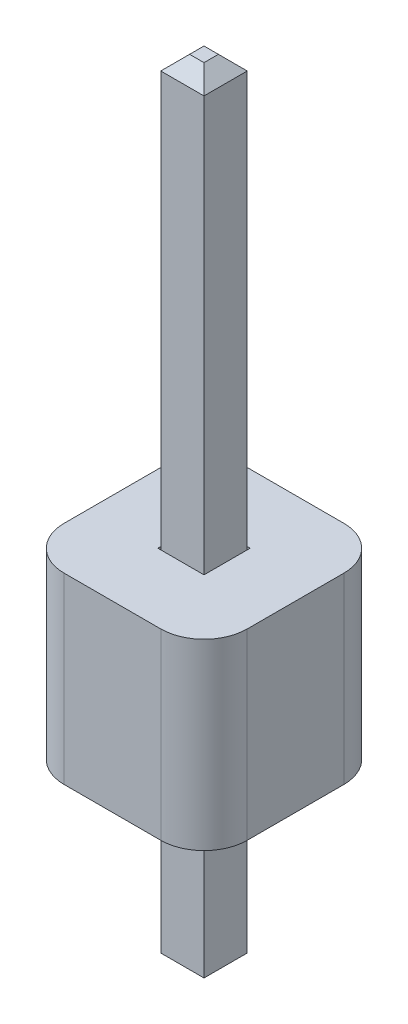
ISO-10303-21;
HEADER;
FILE_DESCRIPTION(('STEP AP214'),'2;1');
FILE_NAME('part.step','',(''),(''),'','','');
FILE_SCHEMA(('AUTOMOTIVE_DESIGN { 1 0 10303 214 1 1 1 1 }'));
ENDSEC;
DATA;
#1=APPLICATION_CONTEXT('core data for automotive mechanical design processes');
#2=APPLICATION_PROTOCOL_DEFINITION('international standard','automotive_design',2000,#1);
#3=PRODUCT_CONTEXT('',#1,'mechanical');
#4=PRODUCT('Part','Part','',(#3));
#5=PRODUCT_RELATED_PRODUCT_CATEGORY('part','',(#4));
#6=PRODUCT_DEFINITION_FORMATION('','',#4);
#7=PRODUCT_DEFINITION_CONTEXT('part definition',#1,'design');
#8=PRODUCT_DEFINITION('design','',#6,#7);
#9=PRODUCT_DEFINITION_SHAPE('','',#8);
#10=(LENGTH_UNIT() NAMED_UNIT(*) SI_UNIT(.MILLI.,.METRE.));
#11=(NAMED_UNIT(*) PLANE_ANGLE_UNIT() SI_UNIT($,.RADIAN.));
#12=(NAMED_UNIT(*) SI_UNIT($,.STERADIAN.) SOLID_ANGLE_UNIT());
#13=UNCERTAINTY_MEASURE_WITH_UNIT(LENGTH_MEASURE(1.E-05),#10,'distance_accuracy_value','');
#14=(GEOMETRIC_REPRESENTATION_CONTEXT(3) GLOBAL_UNCERTAINTY_ASSIGNED_CONTEXT((#13)) GLOBAL_UNIT_ASSIGNED_CONTEXT((#10,
#11,#12)) REPRESENTATION_CONTEXT('',''));
#15=CARTESIAN_POINT('',(0.,0.,0.));
#16=DIRECTION('',(0.,0.,1.));
#17=DIRECTION('',(1.,0.,0.));
#18=AXIS2_PLACEMENT_3D('',#15,#16,#17);
#19=CARTESIAN_POINT('',(1.49066350489631,4.06960174745157,6.07838829893415));
#20=DIRECTION('',(1.,0.,0.));
#21=DIRECTION('',(0.,0.,-1.));
#22=AXIS2_PLACEMENT_3D('',#19,#20,#21);
#23=PLANE('',#22);
#24=DIRECTION('',(0.,0.,1.));
#25=VECTOR('',#24,1.);
#26=CARTESIAN_POINT('',(1.49066350489631,1.52960174745157,6.07838829893415));
#27=LINE('',#26,#25);
#28=CARTESIAN_POINT('',(1.49066350489631,1.52960174745157,6.67838829893415));
#29=VERTEX_POINT('',#28);
#30=CARTESIAN_POINT('',(1.49066350489631,1.52960174745157,8.01838829893415));
#31=VERTEX_POINT('',#30);
#32=EDGE_CURVE('P0_E144',#29,#31,#27,.T.);
#33=ORIENTED_EDGE('',*,*,#32,.T.);
#34=DIRECTION('',(0.,-1.,0.));
#35=VECTOR('',#34,1.);
#36=CARTESIAN_POINT('',(1.49066350489631,4.06960174745157,8.01838829893415));
#37=LINE('',#36,#35);
#38=CARTESIAN_POINT('',(1.49066350489631,4.06960174745157,8.01838829893415));
#39=VERTEX_POINT('',#38);
#40=EDGE_CURVE('P0_E183',#31,#39,#37,.F.);
#41=ORIENTED_EDGE('',*,*,#40,.T.);
#42=DIRECTION('',(0.,0.,1.));
#43=VECTOR('',#42,1.);
#44=CARTESIAN_POINT('',(1.49066350489631,4.06960174745157,6.07838829893415));
#45=LINE('',#44,#43);
#46=CARTESIAN_POINT('',(1.49066350489631,4.06960174745157,6.67838829893415));
#47=VERTEX_POINT('',#46);
#48=EDGE_CURVE('P0_E148',#47,#39,#45,.T.);
#49=ORIENTED_EDGE('',*,*,#48,.F.);
#50=DIRECTION('',(0.,-1.,0.));
#51=VECTOR('',#50,1.);
#52=CARTESIAN_POINT('',(1.49066350489631,4.06960174745157,6.67838829893415));
#53=LINE('',#52,#51);
#54=EDGE_CURVE('P0_E159',#47,#29,#53,.T.);
#55=ORIENTED_EDGE('',*,*,#54,.T.);
#56=EDGE_LOOP('',(#33,#41,#49,#55));
#57=FACE_BOUND('',#56,.T.);
#58=ADVANCED_FACE('P0_F16',(#57),#23,.F.);
#59=CARTESIAN_POINT('',(1.49066350489631,4.06960174745157,8.61838829893415));
#60=DIRECTION('',(0.,0.,-1.));
#61=DIRECTION('',(-1.,0.,0.));
#62=AXIS2_PLACEMENT_3D('',#59,#60,#61);
#63=PLANE('',#62);
#64=DIRECTION('',(1.,0.,0.));
#65=VECTOR('',#64,1.);
#66=CARTESIAN_POINT('',(1.49066350489631,1.52960174745157,8.61838829893415));
#67=LINE('',#66,#65);
#68=CARTESIAN_POINT('',(2.09066350489631,1.52960174745157,8.61838829893415));
#69=VERTEX_POINT('',#68);
#70=CARTESIAN_POINT('',(3.43066350489631,1.52960174745157,8.61838829893415));
#71=VERTEX_POINT('',#70);
#72=EDGE_CURVE('P0_E162',#69,#71,#67,.T.);
#73=ORIENTED_EDGE('',*,*,#72,.T.);
#74=DIRECTION('',(0.,-1.,0.));
#75=VECTOR('',#74,1.);
#76=CARTESIAN_POINT('',(3.43066350489631,4.06960174745157,8.61838829893415));
#77=LINE('',#76,#75);
#78=CARTESIAN_POINT('',(3.43066350489631,4.06960174745157,8.61838829893415));
#79=VERTEX_POINT('',#78);
#80=EDGE_CURVE('P0_E192',#71,#79,#77,.F.);
#81=ORIENTED_EDGE('',*,*,#80,.T.);
#82=DIRECTION('',(1.,0.,0.));
#83=VECTOR('',#82,1.);
#84=CARTESIAN_POINT('',(1.49066350489631,4.06960174745157,8.61838829893415));
#85=LINE('',#84,#83);
#86=CARTESIAN_POINT('',(2.09066350489631,4.06960174745157,8.61838829893415));
#87=VERTEX_POINT('',#86);
#88=EDGE_CURVE('P0_E151',#87,#79,#85,.T.);
#89=ORIENTED_EDGE('',*,*,#88,.F.);
#90=DIRECTION('',(0.,-1.,0.));
#91=VECTOR('',#90,1.);
#92=CARTESIAN_POINT('',(2.09066350489631,4.06960174745157,8.61838829893415));
#93=LINE('',#92,#91);
#94=EDGE_CURVE('P0_E178',#87,#69,#93,.T.);
#95=ORIENTED_EDGE('',*,*,#94,.T.);
#96=EDGE_LOOP('',(#73,#81,#89,#95));
#97=FACE_BOUND('',#96,.T.);
#98=ADVANCED_FACE('P0_F223',(#97),#63,.F.);
#99=CARTESIAN_POINT('',(4.03066350489631,4.06960174745157,6.07838829893415));
#100=DIRECTION('',(-1.,0.,0.));
#101=DIRECTION('',(0.,0.,1.));
#102=AXIS2_PLACEMENT_3D('',#99,#100,#101);
#103=PLANE('',#102);
#104=DIRECTION('',(0.,0.,-1.));
#105=VECTOR('',#104,1.);
#106=CARTESIAN_POINT('',(4.03066350489631,1.52960174745157,6.07838829893415));
#107=LINE('',#106,#105);
#108=CARTESIAN_POINT('',(4.03066350489631,1.52960174745157,8.01838829893415));
#109=VERTEX_POINT('',#108);
#110=CARTESIAN_POINT('',(4.03066350489631,1.52960174745157,6.67838829893415));
#111=VERTEX_POINT('',#110);
#112=EDGE_CURVE('P0_E165',#109,#111,#107,.T.);
#113=ORIENTED_EDGE('',*,*,#112,.T.);
#114=DIRECTION('',(0.,-1.,0.));
#115=VECTOR('',#114,1.);
#116=CARTESIAN_POINT('',(4.03066350489631,4.06960174745157,6.67838829893415));
#117=LINE('',#116,#115);
#118=CARTESIAN_POINT('',(4.03066350489631,4.06960174745157,6.67838829893415));
#119=VERTEX_POINT('',#118);
#120=EDGE_CURVE('P0_E24',#111,#119,#117,.F.);
#121=ORIENTED_EDGE('',*,*,#120,.T.);
#122=DIRECTION('',(0.,0.,-1.));
#123=VECTOR('',#122,1.);
#124=CARTESIAN_POINT('',(4.03066350489631,4.06960174745157,6.07838829893415));
#125=LINE('',#124,#123);
#126=CARTESIAN_POINT('',(4.03066350489631,4.06960174745157,8.01838829893415));
#127=VERTEX_POINT('',#126);
#128=EDGE_CURVE('P0_E155',#127,#119,#125,.T.);
#129=ORIENTED_EDGE('',*,*,#128,.F.);
#130=DIRECTION('',(0.,-1.,0.));
#131=VECTOR('',#130,1.);
#132=CARTESIAN_POINT('',(4.03066350489631,4.06960174745157,8.01838829893415));
#133=LINE('',#132,#131);
#134=EDGE_CURVE('P0_E187',#127,#109,#133,.T.);
#135=ORIENTED_EDGE('',*,*,#134,.T.);
#136=EDGE_LOOP('',(#113,#121,#129,#135));
#137=FACE_BOUND('',#136,.T.);
#138=ADVANCED_FACE('P0_F229',(#137),#103,.F.);
#139=CARTESIAN_POINT('',(1.49066350489631,4.06960174745157,6.07838829893415));
#140=DIRECTION('',(0.,0.,1.));
#141=DIRECTION('',(1.,0.,0.));
#142=AXIS2_PLACEMENT_3D('',#139,#140,#141);
#143=PLANE('',#142);
#144=DIRECTION('',(-1.,0.,0.));
#145=VECTOR('',#144,1.);
#146=CARTESIAN_POINT('',(1.49066350489631,4.06960174745157,6.07838829893415));
#147=LINE('',#146,#145);
#148=CARTESIAN_POINT('',(3.43066350489631,4.06960174745157,6.07838829893415));
#149=VERTEX_POINT('',#148);
#150=CARTESIAN_POINT('',(2.09066350489631,4.06960174745157,6.07838829893415));
#151=VERTEX_POINT('',#150);
#152=EDGE_CURVE('P0_E157',#149,#151,#147,.T.);
#153=ORIENTED_EDGE('',*,*,#152,.F.);
#154=DIRECTION('',(0.,-1.,0.));
#155=VECTOR('',#154,1.);
#156=CARTESIAN_POINT('',(3.43066350489631,4.06960174745157,6.07838829893415));
#157=LINE('',#156,#155);
#158=CARTESIAN_POINT('',(3.43066350489631,1.52960174745157,6.07838829893415));
#159=VERTEX_POINT('',#158);
#160=EDGE_CURVE('P0_E196',#149,#159,#157,.T.);
#161=ORIENTED_EDGE('',*,*,#160,.T.);
#162=DIRECTION('',(-1.,0.,0.));
#163=VECTOR('',#162,1.);
#164=CARTESIAN_POINT('',(1.49066350489631,1.52960174745157,6.07838829893415));
#165=LINE('',#164,#163);
#166=CARTESIAN_POINT('',(2.09066350489631,1.52960174745157,6.07838829893415));
#167=VERTEX_POINT('',#166);
#168=EDGE_CURVE('P0_E152',#159,#167,#165,.T.);
#169=ORIENTED_EDGE('',*,*,#168,.T.);
#170=DIRECTION('',(0.,-1.,0.));
#171=VECTOR('',#170,1.);
#172=CARTESIAN_POINT('',(2.09066350489631,4.06960174745157,6.07838829893415));
#173=LINE('',#172,#171);
#174=EDGE_CURVE('P0_E173',#167,#151,#173,.F.);
#175=ORIENTED_EDGE('',*,*,#174,.T.);
#176=EDGE_LOOP('',(#153,#161,#169,#175));
#177=FACE_BOUND('',#176,.T.);
#178=ADVANCED_FACE('P0_F202',(#177),#143,.F.);
#179=CARTESIAN_POINT('',(2.54447713770809,4.06960174745157,7.5896703174323));
#180=DIRECTION('',(0.,1.,0.));
#181=DIRECTION('',(0.,0.,1.));
#182=AXIS2_PLACEMENT_3D('',#179,#180,#181);
#183=PLANE('',#182);
#184=DIRECTION('',(0.,0.,-1.));
#185=VECTOR('',#184,1.);
#186=CARTESIAN_POINT('',(3.08066350489631,4.06960174745157,7.66838829893415));
#187=LINE('',#186,#185);
#188=CARTESIAN_POINT('',(3.08066350489631,4.06960174745157,7.66838829893415));
#189=VERTEX_POINT('',#188);
#190=CARTESIAN_POINT('',(3.08066350489631,4.06960174745157,7.02838829893415));
#191=VERTEX_POINT('',#190);
#192=EDGE_CURVE('P0_E112',#189,#191,#187,.T.);
#193=ORIENTED_EDGE('',*,*,#192,.F.);
#194=DIRECTION('',(1.,0.,0.));
#195=VECTOR('',#194,1.);
#196=CARTESIAN_POINT('',(2.44066350489631,4.06960174745157,7.66838829893415));
#197=LINE('',#196,#195);
#198=CARTESIAN_POINT('',(2.44066350489631,4.06960174745157,7.66838829893415));
#199=VERTEX_POINT('',#198);
#200=EDGE_CURVE('P0_E129',#199,#189,#197,.T.);
#201=ORIENTED_EDGE('',*,*,#200,.F.);
#202=DIRECTION('',(0.,0.,1.));
#203=VECTOR('',#202,1.);
#204=CARTESIAN_POINT('',(2.44066350489631,4.06960174745157,7.66838829893415));
#205=LINE('',#204,#203);
#206=CARTESIAN_POINT('',(2.44066350489631,4.06960174745157,7.02838829893415));
#207=VERTEX_POINT('',#206);
#208=EDGE_CURVE('P0_E132',#207,#199,#205,.T.);
#209=ORIENTED_EDGE('',*,*,#208,.F.);
#210=DIRECTION('',(-1.,0.,0.));
#211=VECTOR('',#210,1.);
#212=CARTESIAN_POINT('',(2.44066350489631,4.06960174745157,7.02838829893415));
#213=LINE('',#212,#211);
#214=EDGE_CURVE('P0_E138',#191,#207,#213,.T.);
#215=ORIENTED_EDGE('',*,*,#214,.F.);
#216=EDGE_LOOP('',(#193,#201,#209,#215));
#217=FACE_BOUND('',#216,.T.);
#218=ORIENTED_EDGE('',*,*,#128,.T.);
#219=CARTESIAN_POINT('',(3.43066350489631,4.06960174745157,6.67838829893415));
#220=DIRECTION('',(0.,1.,0.));
#221=DIRECTION('',(0.,0.,1.));
#222=AXIS2_PLACEMENT_3D('',#219,#220,#221);
#223=CIRCLE('',#222,0.6);
#224=EDGE_CURVE('P0_E10',#119,#149,#223,.T.);
#225=ORIENTED_EDGE('',*,*,#224,.T.);
#226=ORIENTED_EDGE('',*,*,#152,.T.);
#227=CARTESIAN_POINT('',(2.09066350489631,4.06960174745157,6.67838829893415));
#228=DIRECTION('',(0.,1.,0.));
#229=DIRECTION('',(0.,0.,1.));
#230=AXIS2_PLACEMENT_3D('',#227,#228,#229);
#231=CIRCLE('',#230,0.6);
#232=EDGE_CURVE('P0_E176',#151,#47,#231,.T.);
#233=ORIENTED_EDGE('',*,*,#232,.T.);
#234=ORIENTED_EDGE('',*,*,#48,.T.);
#235=CARTESIAN_POINT('',(2.09066350489631,4.06960174745157,8.01838829893415));
#236=DIRECTION('',(0.,1.,0.));
#237=DIRECTION('',(0.,0.,1.));
#238=AXIS2_PLACEMENT_3D('',#235,#236,#237);
#239=CIRCLE('',#238,0.6);
#240=EDGE_CURVE('P0_E185',#39,#87,#239,.T.);
#241=ORIENTED_EDGE('',*,*,#240,.T.);
#242=ORIENTED_EDGE('',*,*,#88,.T.);
#243=CARTESIAN_POINT('',(3.43066350489631,4.06960174745157,8.01838829893415));
#244=DIRECTION('',(0.,1.,0.));
#245=DIRECTION('',(0.,0.,1.));
#246=AXIS2_PLACEMENT_3D('',#243,#244,#245);
#247=CIRCLE('',#246,0.6);
#248=EDGE_CURVE('P0_E194',#79,#127,#247,.T.);
#249=ORIENTED_EDGE('',*,*,#248,.T.);
#250=EDGE_LOOP('',(#218,#225,#226,#233,#234,#241,#242,#249));
#251=FACE_BOUND('',#250,.T.);
#252=ADVANCED_FACE('P0_F213',(#217,#251),#183,.T.);
#253=CARTESIAN_POINT('',(2.54447713770809,1.52960174745157,7.5896703174323));
#254=DIRECTION('',(0.,1.,0.));
#255=DIRECTION('',(0.,0.,1.));
#256=AXIS2_PLACEMENT_3D('',#253,#254,#255);
#257=PLANE('',#256);
#258=DIRECTION('',(1.,0.,0.));
#259=VECTOR('',#258,1.);
#260=CARTESIAN_POINT('',(2.44066350489631,1.52960174745157,7.66838829893415));
#261=LINE('',#260,#259);
#262=CARTESIAN_POINT('',(2.44066350489631,1.52960174745157,7.66838829893415));
#263=VERTEX_POINT('',#262);
#264=CARTESIAN_POINT('',(3.08066350489631,1.52960174745157,7.66838829893415));
#265=VERTEX_POINT('',#264);
#266=EDGE_CURVE('P0_E117',#263,#265,#261,.T.);
#267=ORIENTED_EDGE('',*,*,#266,.T.);
#268=DIRECTION('',(0.,0.,-1.));
#269=VECTOR('',#268,1.);
#270=CARTESIAN_POINT('',(3.08066350489631,1.52960174745157,7.66838829893415));
#271=LINE('',#270,#269);
#272=CARTESIAN_POINT('',(3.08066350489631,1.52960174745157,7.02838829893415));
#273=VERTEX_POINT('',#272);
#274=EDGE_CURVE('P0_E109',#265,#273,#271,.T.);
#275=ORIENTED_EDGE('',*,*,#274,.T.);
#276=DIRECTION('',(-1.,0.,0.));
#277=VECTOR('',#276,1.);
#278=CARTESIAN_POINT('',(2.44066350489631,1.52960174745157,7.02838829893415));
#279=LINE('',#278,#277);
#280=CARTESIAN_POINT('',(2.44066350489631,1.52960174745157,7.02838829893415));
#281=VERTEX_POINT('',#280);
#282=EDGE_CURVE('P0_E121',#273,#281,#279,.T.);
#283=ORIENTED_EDGE('',*,*,#282,.T.);
#284=DIRECTION('',(0.,0.,1.));
#285=VECTOR('',#284,1.);
#286=CARTESIAN_POINT('',(2.44066350489631,1.52960174745157,7.66838829893415));
#287=LINE('',#286,#285);
#288=EDGE_CURVE('P0_E125',#281,#263,#287,.T.);
#289=ORIENTED_EDGE('',*,*,#288,.T.);
#290=EDGE_LOOP('',(#267,#275,#283,#289));
#291=FACE_BOUND('',#290,.T.);
#292=ORIENTED_EDGE('',*,*,#168,.F.);
#293=CARTESIAN_POINT('',(3.43066350489631,1.52960174745157,6.67838829893415));
#294=DIRECTION('',(0.,1.,0.));
#295=DIRECTION('',(0.,0.,1.));
#296=AXIS2_PLACEMENT_3D('',#293,#294,#295);
#297=CIRCLE('',#296,0.6);
#298=EDGE_CURVE('P0_E38',#159,#111,#297,.F.);
#299=ORIENTED_EDGE('',*,*,#298,.T.);
#300=ORIENTED_EDGE('',*,*,#112,.F.);
#301=CARTESIAN_POINT('',(3.43066350489631,1.52960174745157,8.01838829893415));
#302=DIRECTION('',(0.,1.,0.));
#303=DIRECTION('',(0.,0.,1.));
#304=AXIS2_PLACEMENT_3D('',#301,#302,#303);
#305=CIRCLE('',#304,0.6);
#306=EDGE_CURVE('P0_E190',#109,#71,#305,.F.);
#307=ORIENTED_EDGE('',*,*,#306,.T.);
#308=ORIENTED_EDGE('',*,*,#72,.F.);
#309=CARTESIAN_POINT('',(2.09066350489631,1.52960174745157,8.01838829893415));
#310=DIRECTION('',(0.,1.,0.));
#311=DIRECTION('',(0.,0.,1.));
#312=AXIS2_PLACEMENT_3D('',#309,#310,#311);
#313=CIRCLE('',#312,0.6);
#314=EDGE_CURVE('P0_E181',#69,#31,#313,.F.);
#315=ORIENTED_EDGE('',*,*,#314,.T.);
#316=ORIENTED_EDGE('',*,*,#32,.F.);
#317=CARTESIAN_POINT('',(2.09066350489631,1.52960174745157,6.67838829893415));
#318=DIRECTION('',(0.,1.,0.));
#319=DIRECTION('',(0.,0.,1.));
#320=AXIS2_PLACEMENT_3D('',#317,#318,#319);
#321=CIRCLE('',#320,0.6);
#322=EDGE_CURVE('P0_E170',#29,#167,#321,.F.);
#323=ORIENTED_EDGE('',*,*,#322,.T.);
#324=EDGE_LOOP('',(#292,#299,#300,#307,#308,#315,#316,#323));
#325=FACE_BOUND('',#324,.T.);
#326=ADVANCED_FACE('P0_F127',(#291,#325),#257,.F.);
#327=CARTESIAN_POINT('',(3.08066350489631,1.52960174745157,7.66838829893415));
#328=DIRECTION('',(1.,0.,0.));
#329=DIRECTION('',(0.,0.,-1.));
#330=AXIS2_PLACEMENT_3D('',#327,#328,#329);
#331=PLANE('',#330);
#332=ORIENTED_EDGE('',*,*,#192,.T.);
#333=DIRECTION('',(0.,1.,0.));
#334=VECTOR('',#333,1.);
#335=CARTESIAN_POINT('',(3.08066350489631,1.52960174745157,7.02838829893415));
#336=LINE('',#335,#334);
#337=EDGE_CURVE('P0_E105',#273,#191,#336,.T.);
#338=ORIENTED_EDGE('',*,*,#337,.F.);
#339=ORIENTED_EDGE('',*,*,#274,.F.);
#340=DIRECTION('',(0.,1.,0.));
#341=VECTOR('',#340,1.);
#342=CARTESIAN_POINT('',(3.08066350489631,1.52960174745157,7.66838829893415));
#343=LINE('',#342,#341);
#344=EDGE_CURVE('P0_E142',#265,#189,#343,.T.);
#345=ORIENTED_EDGE('',*,*,#344,.T.);
#346=EDGE_LOOP('',(#332,#338,#339,#345));
#347=FACE_BOUND('',#346,.T.);
#348=ADVANCED_FACE('P0_F107',(#347),#331,.F.);
#349=CARTESIAN_POINT('',(2.44066350489631,1.52960174745157,7.66838829893415));
#350=DIRECTION('',(0.,0.,1.));
#351=DIRECTION('',(1.,0.,0.));
#352=AXIS2_PLACEMENT_3D('',#349,#350,#351);
#353=PLANE('',#352);
#354=ORIENTED_EDGE('',*,*,#200,.T.);
#355=ORIENTED_EDGE('',*,*,#344,.F.);
#356=ORIENTED_EDGE('',*,*,#266,.F.);
#357=DIRECTION('',(0.,1.,0.));
#358=VECTOR('',#357,1.);
#359=CARTESIAN_POINT('',(2.44066350489631,1.52960174745157,7.66838829893415));
#360=LINE('',#359,#358);
#361=EDGE_CURVE('P0_E145',#263,#199,#360,.T.);
#362=ORIENTED_EDGE('',*,*,#361,.T.);
#363=EDGE_LOOP('',(#354,#355,#356,#362));
#364=FACE_BOUND('',#363,.T.);
#365=ADVANCED_FACE('P0_F289',(#364),#353,.F.);
#366=CARTESIAN_POINT('',(2.44066350489631,1.52960174745157,7.66838829893415));
#367=DIRECTION('',(-1.,0.,0.));
#368=DIRECTION('',(0.,0.,1.));
#369=AXIS2_PLACEMENT_3D('',#366,#367,#368);
#370=PLANE('',#369);
#371=ORIENTED_EDGE('',*,*,#208,.T.);
#372=ORIENTED_EDGE('',*,*,#361,.F.);
#373=ORIENTED_EDGE('',*,*,#288,.F.);
#374=DIRECTION('',(0.,1.,0.));
#375=VECTOR('',#374,1.);
#376=CARTESIAN_POINT('',(2.44066350489631,1.52960174745157,7.02838829893415));
#377=LINE('',#376,#375);
#378=EDGE_CURVE('P0_E116',#281,#207,#377,.T.);
#379=ORIENTED_EDGE('',*,*,#378,.T.);
#380=EDGE_LOOP('',(#371,#372,#373,#379));
#381=FACE_BOUND('',#380,.T.);
#382=ADVANCED_FACE('P0_F281',(#381),#370,.F.);
#383=CARTESIAN_POINT('',(2.44066350489631,1.52960174745157,7.02838829893415));
#384=DIRECTION('',(0.,0.,-1.));
#385=DIRECTION('',(-1.,0.,0.));
#386=AXIS2_PLACEMENT_3D('',#383,#384,#385);
#387=PLANE('',#386);
#388=ORIENTED_EDGE('',*,*,#214,.T.);
#389=ORIENTED_EDGE('',*,*,#378,.F.);
#390=ORIENTED_EDGE('',*,*,#282,.F.);
#391=ORIENTED_EDGE('',*,*,#337,.T.);
#392=EDGE_LOOP('',(#388,#389,#390,#391));
#393=FACE_BOUND('',#392,.T.);
#394=ADVANCED_FACE('P0_F122',(#393),#387,.F.);
#395=CARTESIAN_POINT('',(2.09066350489631,4.06960174745157,6.67838829893415));
#396=DIRECTION('',(0.,-1.,0.));
#397=DIRECTION('',(0.,0.,-1.));
#398=AXIS2_PLACEMENT_3D('',#395,#396,#397);
#399=CYLINDRICAL_SURFACE('',#398,0.6);
#400=ORIENTED_EDGE('',*,*,#232,.F.);
#401=ORIENTED_EDGE('',*,*,#174,.F.);
#402=ORIENTED_EDGE('',*,*,#322,.F.);
#403=ORIENTED_EDGE('',*,*,#54,.F.);
#404=EDGE_LOOP('',(#400,#401,#402,#403));
#405=FACE_BOUND('',#404,.T.);
#406=ADVANCED_FACE('P0_F210',(#405),#399,.T.);
#407=CARTESIAN_POINT('',(2.09066350489631,4.06960174745157,8.01838829893415));
#408=DIRECTION('',(0.,-1.,0.));
#409=DIRECTION('',(0.,0.,-1.));
#410=AXIS2_PLACEMENT_3D('',#407,#408,#409);
#411=CYLINDRICAL_SURFACE('',#410,0.6);
#412=ORIENTED_EDGE('',*,*,#240,.F.);
#413=ORIENTED_EDGE('',*,*,#40,.F.);
#414=ORIENTED_EDGE('',*,*,#314,.F.);
#415=ORIENTED_EDGE('',*,*,#94,.F.);
#416=EDGE_LOOP('',(#412,#413,#414,#415));
#417=FACE_BOUND('',#416,.T.);
#418=ADVANCED_FACE('P0_F218',(#417),#411,.T.);
#419=CARTESIAN_POINT('',(3.43066350489631,4.06960174745157,8.01838829893415));
#420=DIRECTION('',(0.,-1.,0.));
#421=DIRECTION('',(0.,0.,-1.));
#422=AXIS2_PLACEMENT_3D('',#419,#420,#421);
#423=CYLINDRICAL_SURFACE('',#422,0.6);
#424=ORIENTED_EDGE('',*,*,#248,.F.);
#425=ORIENTED_EDGE('',*,*,#80,.F.);
#426=ORIENTED_EDGE('',*,*,#306,.F.);
#427=ORIENTED_EDGE('',*,*,#134,.F.);
#428=EDGE_LOOP('',(#424,#425,#426,#427));
#429=FACE_BOUND('',#428,.T.);
#430=ADVANCED_FACE('P0_F227',(#429),#423,.T.);
#431=CARTESIAN_POINT('',(3.43066350489631,4.06960174745157,6.67838829893415));
#432=DIRECTION('',(0.,-1.,0.));
#433=DIRECTION('',(0.,0.,-1.));
#434=AXIS2_PLACEMENT_3D('',#431,#432,#433);
#435=CYLINDRICAL_SURFACE('',#434,0.6);
#436=ORIENTED_EDGE('',*,*,#224,.F.);
#437=ORIENTED_EDGE('',*,*,#120,.F.);
#438=ORIENTED_EDGE('',*,*,#298,.F.);
#439=ORIENTED_EDGE('',*,*,#160,.F.);
#440=EDGE_LOOP('',(#436,#437,#438,#439));
#441=FACE_BOUND('',#440,.T.);
#442=ADVANCED_FACE('P0_F18',(#441),#435,.T.);
#443=CLOSED_SHELL('',(#58,#98,#138,#178,#252,#326,#348,#365,#382,#394,#406,#418,#430,#442));
#444=MANIFOLD_SOLID_BREP('P0_B1',#443);
#445=CARTESIAN_POINT('',(2.44066350489631,9.98484253965518,7.02838829893415));
#446=DIRECTION('',(1.,0.,0.));
#447=DIRECTION('',(0.,0.,-1.));
#448=AXIS2_PLACEMENT_3D('',#445,#446,#447);
#449=PLANE('',#448);
#450=DIRECTION('',(0.,-1.,0.));
#451=VECTOR('',#450,1.);
#452=CARTESIAN_POINT('',(2.44066350489631,9.98484253965518,7.02838829893415));
#453=LINE('',#452,#451);
#454=CARTESIAN_POINT('',(2.44066350489631,9.78484253965518,7.02838829893415));
#455=VERTEX_POINT('',#454);
#456=CARTESIAN_POINT('',(2.44066350489631,-0.815157460344818,7.02838829893415));
#457=VERTEX_POINT('',#456);
#458=EDGE_CURVE('P1_E128',#455,#457,#453,.T.);
#459=ORIENTED_EDGE('',*,*,#458,.T.);
#460=DIRECTION('',(0.,0.,1.));
#461=VECTOR('',#460,1.);
#462=CARTESIAN_POINT('',(2.44066350489631,-0.815157460344818,7.02838829893415));
#463=LINE('',#462,#461);
#464=CARTESIAN_POINT('',(2.44066350489631,-0.815157460344818,7.62838829893415));
#465=VERTEX_POINT('',#464);
#466=EDGE_CURVE('P1_E11',#457,#465,#463,.T.);
#467=ORIENTED_EDGE('',*,*,#466,.T.);
#468=DIRECTION('',(0.,-1.,0.));
#469=VECTOR('',#468,1.);
#470=CARTESIAN_POINT('',(2.44066350489631,9.98484253965518,7.62838829893415));
#471=LINE('',#470,#469);
#472=CARTESIAN_POINT('',(2.44066350489631,9.78484253965518,7.62838829893415));
#473=VERTEX_POINT('',#472);
#474=EDGE_CURVE('P1_E105',#473,#465,#471,.T.);
#475=ORIENTED_EDGE('',*,*,#474,.F.);
#476=DIRECTION('',(0.,0.,-1.));
#477=VECTOR('',#476,1.);
#478=CARTESIAN_POINT('',(2.44066350489631,9.78484253965518,7.02838829893415));
#479=LINE('',#478,#477);
#480=EDGE_CURVE('P1_E92',#473,#455,#479,.T.);
#481=ORIENTED_EDGE('',*,*,#480,.T.);
#482=EDGE_LOOP('',(#459,#467,#475,#481));
#483=FACE_BOUND('',#482,.T.);
#484=ADVANCED_FACE('P1_F17',(#483),#449,.F.);
#485=CARTESIAN_POINT('',(2.44066350489631,9.98484253965518,7.62838829893415));
#486=DIRECTION('',(0.,0.,-1.));
#487=DIRECTION('',(-1.,0.,0.));
#488=AXIS2_PLACEMENT_3D('',#485,#486,#487);
#489=PLANE('',#488);
#490=ORIENTED_EDGE('',*,*,#474,.T.);
#491=DIRECTION('',(1.,0.,0.));
#492=VECTOR('',#491,1.);
#493=CARTESIAN_POINT('',(2.44066350489631,-0.815157460344818,7.62838829893415));
#494=LINE('',#493,#492);
#495=CARTESIAN_POINT('',(3.04066350489631,-0.815157460344818,7.62838829893415));
#496=VERTEX_POINT('',#495);
#497=EDGE_CURVE('P1_E121',#465,#496,#494,.T.);
#498=ORIENTED_EDGE('',*,*,#497,.T.);
#499=DIRECTION('',(0.,-1.,0.));
#500=VECTOR('',#499,1.);
#501=CARTESIAN_POINT('',(3.04066350489631,9.98484253965518,7.62838829893415));
#502=LINE('',#501,#500);
#503=CARTESIAN_POINT('',(3.04066350489631,9.78484253965518,7.62838829893415));
#504=VERTEX_POINT('',#503);
#505=EDGE_CURVE('P1_E171',#504,#496,#502,.T.);
#506=ORIENTED_EDGE('',*,*,#505,.F.);
#507=DIRECTION('',(-1.,0.,0.));
#508=VECTOR('',#507,1.);
#509=CARTESIAN_POINT('',(2.44066350489631,9.78484253965518,7.62838829893415));
#510=LINE('',#509,#508);
#511=EDGE_CURVE('P1_E120',#504,#473,#510,.T.);
#512=ORIENTED_EDGE('',*,*,#511,.T.);
#513=EDGE_LOOP('',(#490,#498,#506,#512));
#514=FACE_BOUND('',#513,.T.);
#515=ADVANCED_FACE('P1_F170',(#514),#489,.F.);
#516=CARTESIAN_POINT('',(3.04066350489631,9.98484253965518,7.02838829893415));
#517=DIRECTION('',(-1.,0.,0.));
#518=DIRECTION('',(0.,0.,1.));
#519=AXIS2_PLACEMENT_3D('',#516,#517,#518);
#520=PLANE('',#519);
#521=ORIENTED_EDGE('',*,*,#505,.T.);
#522=DIRECTION('',(0.,0.,-1.));
#523=VECTOR('',#522,1.);
#524=CARTESIAN_POINT('',(3.04066350489631,-0.815157460344818,7.02838829893415));
#525=LINE('',#524,#523);
#526=CARTESIAN_POINT('',(3.04066350489631,-0.815157460344818,7.02838829893415));
#527=VERTEX_POINT('',#526);
#528=EDGE_CURVE('P1_E41',#496,#527,#525,.T.);
#529=ORIENTED_EDGE('',*,*,#528,.T.);
#530=DIRECTION('',(0.,-1.,0.));
#531=VECTOR('',#530,1.);
#532=CARTESIAN_POINT('',(3.04066350489631,9.98484253965518,7.02838829893415));
#533=LINE('',#532,#531);
#534=CARTESIAN_POINT('',(3.04066350489631,9.78484253965518,7.02838829893415));
#535=VERTEX_POINT('',#534);
#536=EDGE_CURVE('P1_E175',#535,#527,#533,.T.);
#537=ORIENTED_EDGE('',*,*,#536,.F.);
#538=DIRECTION('',(0.,0.,1.));
#539=VECTOR('',#538,1.);
#540=CARTESIAN_POINT('',(3.04066350489631,9.78484253965518,7.62838829893415));
#541=LINE('',#540,#539);
#542=EDGE_CURVE('P1_E118',#535,#504,#541,.T.);
#543=ORIENTED_EDGE('',*,*,#542,.T.);
#544=EDGE_LOOP('',(#521,#529,#537,#543));
#545=FACE_BOUND('',#544,.T.);
#546=ADVANCED_FACE('P1_F173',(#545),#520,.F.);
#547=CARTESIAN_POINT('',(2.44066350489631,9.98484253965518,7.02838829893415));
#548=DIRECTION('',(0.,0.,1.));
#549=DIRECTION('',(1.,0.,0.));
#550=AXIS2_PLACEMENT_3D('',#547,#548,#549);
#551=PLANE('',#550);
#552=ORIENTED_EDGE('',*,*,#536,.T.);
#553=DIRECTION('',(-1.,0.,0.));
#554=VECTOR('',#553,1.);
#555=CARTESIAN_POINT('',(2.44066350489631,-0.815157460344818,7.02838829893415));
#556=LINE('',#555,#554);
#557=EDGE_CURVE('P1_E26',#527,#457,#556,.T.);
#558=ORIENTED_EDGE('',*,*,#557,.T.);
#559=ORIENTED_EDGE('',*,*,#458,.F.);
#560=DIRECTION('',(1.,0.,0.));
#561=VECTOR('',#560,1.);
#562=CARTESIAN_POINT('',(3.04066350489631,9.78484253965518,7.02838829893415));
#563=LINE('',#562,#561);
#564=EDGE_CURVE('P1_E112',#455,#535,#563,.T.);
#565=ORIENTED_EDGE('',*,*,#564,.T.);
#566=EDGE_LOOP('',(#552,#558,#559,#565));
#567=FACE_BOUND('',#566,.T.);
#568=ADVANCED_FACE('P1_F187',(#567),#551,.F.);
#569=CARTESIAN_POINT('',(8.71046893371114,9.98484253965518,10.6033555611729));
#570=DIRECTION('',(0.,1.,0.));
#571=DIRECTION('',(0.,0.,1.));
#572=AXIS2_PLACEMENT_3D('',#569,#570,#571);
#573=PLANE('',#572);
#574=DIRECTION('',(-1.,0.,0.));
#575=VECTOR('',#574,1.);
#576=CARTESIAN_POINT('',(2.44066350489631,9.98484253965518,7.22838829893415));
#577=LINE('',#576,#575);
#578=CARTESIAN_POINT('',(2.84066350489631,9.98484253965518,7.22838829893415));
#579=VERTEX_POINT('',#578);
#580=CARTESIAN_POINT('',(2.64066350489631,9.98484253965518,7.22838829893415));
#581=VERTEX_POINT('',#580);
#582=EDGE_CURVE('P1_E109',#579,#581,#577,.T.);
#583=ORIENTED_EDGE('',*,*,#582,.T.);
#584=DIRECTION('',(0.,0.,1.));
#585=VECTOR('',#584,1.);
#586=CARTESIAN_POINT('',(2.64066350489631,9.98484253965518,7.62838829893415));
#587=LINE('',#586,#585);
#588=CARTESIAN_POINT('',(2.64066350489631,9.98484253965518,7.42838829893415));
#589=VERTEX_POINT('',#588);
#590=EDGE_CURVE('P1_E90',#581,#589,#587,.T.);
#591=ORIENTED_EDGE('',*,*,#590,.T.);
#592=DIRECTION('',(1.,0.,0.));
#593=VECTOR('',#592,1.);
#594=CARTESIAN_POINT('',(3.04066350489631,9.98484253965518,7.42838829893415));
#595=LINE('',#594,#593);
#596=CARTESIAN_POINT('',(2.84066350489631,9.98484253965518,7.42838829893415));
#597=VERTEX_POINT('',#596);
#598=EDGE_CURVE('P1_E98',#589,#597,#595,.T.);
#599=ORIENTED_EDGE('',*,*,#598,.T.);
#600=DIRECTION('',(0.,0.,-1.));
#601=VECTOR('',#600,1.);
#602=CARTESIAN_POINT('',(2.84066350489631,9.98484253965518,7.02838829893415));
#603=LINE('',#602,#601);
#604=EDGE_CURVE('P1_E104',#597,#579,#603,.T.);
#605=ORIENTED_EDGE('',*,*,#604,.T.);
#606=EDGE_LOOP('',(#583,#591,#599,#605));
#607=FACE_BOUND('',#606,.T.);
#608=ADVANCED_FACE('P1_F107',(#607),#573,.T.);
#609=CARTESIAN_POINT('',(8.71046893371114,-1.01515746034482,10.6033555611729));
#610=DIRECTION('',(0.,1.,0.));
#611=DIRECTION('',(0.,0.,1.));
#612=AXIS2_PLACEMENT_3D('',#609,#610,#611);
#613=PLANE('',#612);
#614=DIRECTION('',(0.,0.,1.));
#615=VECTOR('',#614,1.);
#616=CARTESIAN_POINT('',(2.84066350489631,-1.01515746034482,10.6033555611729));
#617=LINE('',#616,#615);
#618=CARTESIAN_POINT('',(2.84066350489631,-1.01515746034482,7.22838829893415));
#619=VERTEX_POINT('',#618);
#620=CARTESIAN_POINT('',(2.84066350489631,-1.01515746034482,7.42838829893414));
#621=VERTEX_POINT('',#620);
#622=EDGE_CURVE('P1_E135',#619,#621,#617,.T.);
#623=ORIENTED_EDGE('',*,*,#622,.T.);
#624=DIRECTION('',(-1.,0.,0.));
#625=VECTOR('',#624,1.);
#626=CARTESIAN_POINT('',(8.71046893371114,-1.01515746034482,7.42838829893414));
#627=LINE('',#626,#625);
#628=CARTESIAN_POINT('',(2.64066350489631,-1.01515746034482,7.42838829893414));
#629=VERTEX_POINT('',#628);
#630=EDGE_CURVE('P1_E137',#621,#629,#627,.T.);
#631=ORIENTED_EDGE('',*,*,#630,.T.);
#632=DIRECTION('',(0.,0.,-1.));
#633=VECTOR('',#632,1.);
#634=CARTESIAN_POINT('',(2.64066350489631,-1.01515746034482,10.6033555611729));
#635=LINE('',#634,#633);
#636=CARTESIAN_POINT('',(2.64066350489631,-1.01515746034482,7.22838829893415));
#637=VERTEX_POINT('',#636);
#638=EDGE_CURVE('P1_E131',#629,#637,#635,.T.);
#639=ORIENTED_EDGE('',*,*,#638,.T.);
#640=DIRECTION('',(1.,0.,0.));
#641=VECTOR('',#640,1.);
#642=CARTESIAN_POINT('',(8.71046893371114,-1.01515746034482,7.22838829893415));
#643=LINE('',#642,#641);
#644=EDGE_CURVE('P1_E133',#637,#619,#643,.T.);
#645=ORIENTED_EDGE('',*,*,#644,.T.);
#646=EDGE_LOOP('',(#623,#631,#639,#645));
#647=FACE_BOUND('',#646,.T.);
#648=ADVANCED_FACE('P1_F160',(#647),#613,.F.);
#649=CARTESIAN_POINT('',(2.84066350489631,9.98484253965518,10.6033555611729));
#650=DIRECTION('',(0.707106781186552,0.707106781186543,0.));
#651=DIRECTION('',(0.,0.,1.));
#652=AXIS2_PLACEMENT_3D('',#649,#650,#651);
#653=PLANE('',#652);
#654=DIRECTION('',(-0.577350269189623,0.577350269189631,-0.577350269189623));
#655=VECTOR('',#654,1.);
#656=CARTESIAN_POINT('',(4.79726531450124,8.02824073005023,9.38499010853907));
#657=LINE('',#656,#655);
#658=EDGE_CURVE('P1_E101',#504,#597,#657,.T.);
#659=ORIENTED_EDGE('',*,*,#658,.F.);
#660=ORIENTED_EDGE('',*,*,#542,.F.);
#661=DIRECTION('',(-0.577350269189623,0.577350269189631,0.577350269189623));
#662=VECTOR('',#661,1.);
#663=CARTESIAN_POINT('',(1.71567441748341,11.1098316270681,8.35337738634704));
#664=LINE('',#663,#662);
#665=EDGE_CURVE('P1_E125',#579,#535,#664,.F.);
#666=ORIENTED_EDGE('',*,*,#665,.F.);
#667=ORIENTED_EDGE('',*,*,#604,.F.);
#668=EDGE_LOOP('',(#659,#660,#666,#667));
#669=FACE_BOUND('',#668,.T.);
#670=ADVANCED_FACE('P1_F182',(#669),#653,.T.);
#671=CARTESIAN_POINT('',(8.71046893371114,9.98484253965518,7.22838829893415));
#672=DIRECTION('',(0.,0.707106781186543,-0.707106781186552));
#673=DIRECTION('',(1.,0.,0.));
#674=AXIS2_PLACEMENT_3D('',#671,#672,#673);
#675=PLANE('',#674);
#676=ORIENTED_EDGE('',*,*,#665,.T.);
#677=ORIENTED_EDGE('',*,*,#564,.F.);
#678=DIRECTION('',(0.577350269189623,0.577350269189631,0.577350269189623));
#679=VECTOR('',#678,1.);
#680=CARTESIAN_POINT('',(4.6639319811679,12.0081110159268,9.25165677520574));
#681=LINE('',#680,#679);
#682=EDGE_CURVE('P1_E95',#581,#455,#681,.F.);
#683=ORIENTED_EDGE('',*,*,#682,.F.);
#684=ORIENTED_EDGE('',*,*,#582,.F.);
#685=EDGE_LOOP('',(#676,#677,#683,#684));
#686=FACE_BOUND('',#685,.T.);
#687=ADVANCED_FACE('P1_F185',(#686),#675,.T.);
#688=CARTESIAN_POINT('',(8.71046893371114,9.98484253965518,7.42838829893415));
#689=DIRECTION('',(0.,0.707106781186543,0.707106781186552));
#690=DIRECTION('',(-1.,0.,0.));
#691=AXIS2_PLACEMENT_3D('',#688,#689,#690);
#692=PLANE('',#691);
#693=ORIENTED_EDGE('',*,*,#658,.T.);
#694=ORIENTED_EDGE('',*,*,#598,.F.);
#695=DIRECTION('',(-0.577350269189623,-0.577350269189631,0.577350269189623));
#696=VECTOR('',#695,1.);
#697=CARTESIAN_POINT('',(4.6639319811679,12.0081110159268,5.40511982266255));
#698=LINE('',#697,#696);
#699=EDGE_CURVE('P1_E86',#473,#589,#698,.F.);
#700=ORIENTED_EDGE('',*,*,#699,.F.);
#701=ORIENTED_EDGE('',*,*,#511,.F.);
#702=EDGE_LOOP('',(#693,#694,#700,#701));
#703=FACE_BOUND('',#702,.T.);
#704=ADVANCED_FACE('P1_F99',(#703),#692,.T.);
#705=CARTESIAN_POINT('',(2.64066350489631,9.98484253965518,10.6033555611729));
#706=DIRECTION('',(-0.707106781186552,0.707106781186543,0.));
#707=DIRECTION('',(0.,0.,-1.));
#708=AXIS2_PLACEMENT_3D('',#705,#706,#707);
#709=PLANE('',#708);
#710=ORIENTED_EDGE('',*,*,#682,.T.);
#711=ORIENTED_EDGE('',*,*,#480,.F.);
#712=ORIENTED_EDGE('',*,*,#699,.T.);
#713=ORIENTED_EDGE('',*,*,#590,.F.);
#714=EDGE_LOOP('',(#710,#711,#712,#713));
#715=FACE_BOUND('',#714,.T.);
#716=ADVANCED_FACE('P1_F88',(#715),#709,.T.);
#717=CARTESIAN_POINT('',(2.44066350489631,-0.815157460344818,7.02838829893415));
#718=DIRECTION('',(0.,0.707106781186549,0.707106781186546));
#719=DIRECTION('',(-1.,0.,0.));
#720=AXIS2_PLACEMENT_3D('',#717,#718,#719);
#721=PLANE('',#720);
#722=DIRECTION('',(-0.577350269189627,-0.577350269189624,0.577350269189627));
#723=VECTOR('',#722,1.);
#724=CARTESIAN_POINT('',(2.84066350489631,-1.01515746034482,7.22838829893415));
#725=LINE('',#724,#723);
#726=EDGE_CURVE('P1_E145',#619,#527,#725,.F.);
#727=ORIENTED_EDGE('',*,*,#726,.F.);
#728=ORIENTED_EDGE('',*,*,#644,.F.);
#729=DIRECTION('',(0.577350269189627,-0.577350269189624,0.577350269189627));
#730=VECTOR('',#729,1.);
#731=CARTESIAN_POINT('',(2.44066350489631,-0.815157460344818,7.02838829893415));
#732=LINE('',#731,#730);
#733=EDGE_CURVE('P1_E21',#457,#637,#732,.T.);
#734=ORIENTED_EDGE('',*,*,#733,.F.);
#735=ORIENTED_EDGE('',*,*,#557,.F.);
#736=EDGE_LOOP('',(#727,#728,#734,#735));
#737=FACE_BOUND('',#736,.T.);
#738=ADVANCED_FACE('P1_F19',(#737),#721,.F.);
#739=CARTESIAN_POINT('',(2.44066350489631,-0.815157460344818,7.02838829893415));
#740=DIRECTION('',(0.707106781186546,0.707106781186549,0.));
#741=DIRECTION('',(0.,0.,1.));
#742=AXIS2_PLACEMENT_3D('',#739,#740,#741);
#743=PLANE('',#742);
#744=ORIENTED_EDGE('',*,*,#733,.T.);
#745=ORIENTED_EDGE('',*,*,#638,.F.);
#746=DIRECTION('',(-0.577350269189627,0.577350269189624,0.577350269189627));
#747=VECTOR('',#746,1.);
#748=CARTESIAN_POINT('',(2.64066350489631,-1.01515746034482,7.42838829893415));
#749=LINE('',#748,#747);
#750=EDGE_CURVE('P1_E144',#465,#629,#749,.F.);
#751=ORIENTED_EDGE('',*,*,#750,.F.);
#752=ORIENTED_EDGE('',*,*,#466,.F.);
#753=EDGE_LOOP('',(#744,#745,#751,#752));
#754=FACE_BOUND('',#753,.T.);
#755=ADVANCED_FACE('P1_F155',(#754),#743,.F.);
#756=CARTESIAN_POINT('',(3.04066350489631,-0.815157460344818,7.02838829893415));
#757=DIRECTION('',(-0.707106781186546,0.707106781186549,0.));
#758=DIRECTION('',(0.,0.,-1.));
#759=AXIS2_PLACEMENT_3D('',#756,#757,#758);
#760=PLANE('',#759);
#761=ORIENTED_EDGE('',*,*,#726,.T.);
#762=ORIENTED_EDGE('',*,*,#528,.F.);
#763=DIRECTION('',(-0.577350269189627,-0.577350269189624,-0.577350269189627));
#764=VECTOR('',#763,1.);
#765=CARTESIAN_POINT('',(2.84066350489631,-1.01515746034482,7.42838829893415));
#766=LINE('',#765,#764);
#767=EDGE_CURVE('P1_E142',#621,#496,#766,.F.);
#768=ORIENTED_EDGE('',*,*,#767,.F.);
#769=ORIENTED_EDGE('',*,*,#622,.F.);
#770=EDGE_LOOP('',(#761,#762,#768,#769));
#771=FACE_BOUND('',#770,.T.);
#772=ADVANCED_FACE('P1_F166',(#771),#760,.F.);
#773=CARTESIAN_POINT('',(2.44066350489631,-0.815157460344818,7.62838829893415));
#774=DIRECTION('',(0.,0.707106781186549,-0.707106781186546));
#775=DIRECTION('',(1.,0.,0.));
#776=AXIS2_PLACEMENT_3D('',#773,#774,#775);
#777=PLANE('',#776);
#778=ORIENTED_EDGE('',*,*,#750,.T.);
#779=ORIENTED_EDGE('',*,*,#630,.F.);
#780=ORIENTED_EDGE('',*,*,#767,.T.);
#781=ORIENTED_EDGE('',*,*,#497,.F.);
#782=EDGE_LOOP('',(#778,#779,#780,#781));
#783=FACE_BOUND('',#782,.T.);
#784=ADVANCED_FACE('P1_F164',(#783),#777,.F.);
#785=CLOSED_SHELL('',(#484,#515,#546,#568,#608,#648,#670,#687,#704,#716,#738,#755,#772,#784));
#786=MANIFOLD_SOLID_BREP('P1_B1',#785);
#787=ADVANCED_BREP_SHAPE_REPRESENTATION('',(#18,#444,#786),#14);
#788=SHAPE_DEFINITION_REPRESENTATION(#9,#787);
ENDSEC;
END-ISO-10303-21;
